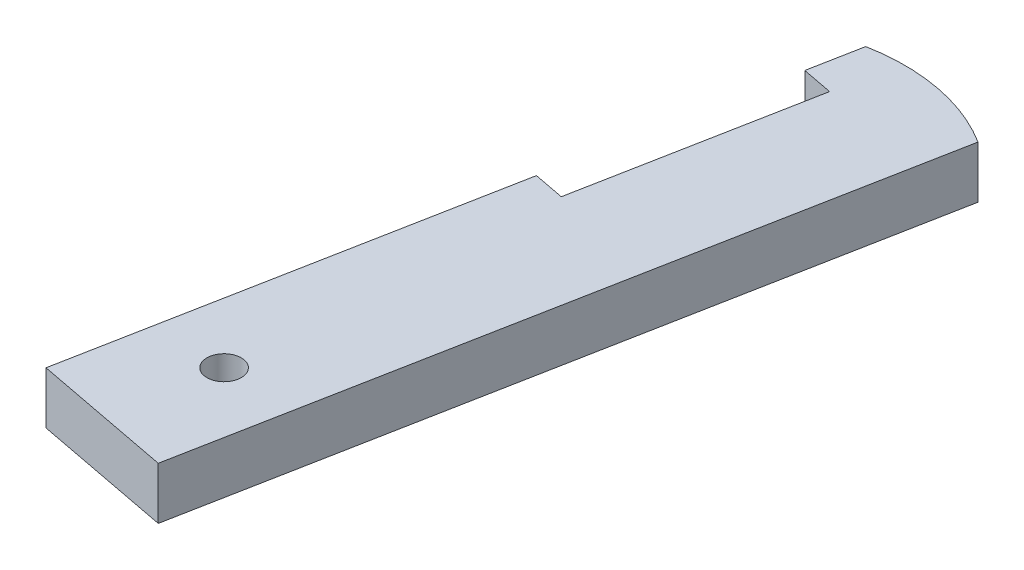
ISO-10303-21;
HEADER;
FILE_DESCRIPTION(('STEP AP214'),'2;1');
FILE_NAME('part.step','',(''),(''),'','','');
FILE_SCHEMA(('AUTOMOTIVE_DESIGN { 1 0 10303 214 1 1 1 1 }'));
ENDSEC;
DATA;
#1=APPLICATION_CONTEXT('core data for automotive mechanical design processes');
#2=APPLICATION_PROTOCOL_DEFINITION('international standard','automotive_design',2000,#1);
#3=PRODUCT_CONTEXT('',#1,'mechanical');
#4=PRODUCT('Part','Part','',(#3));
#5=PRODUCT_RELATED_PRODUCT_CATEGORY('part','',(#4));
#6=PRODUCT_DEFINITION_FORMATION('','',#4);
#7=PRODUCT_DEFINITION_CONTEXT('part definition',#1,'design');
#8=PRODUCT_DEFINITION('design','',#6,#7);
#9=PRODUCT_DEFINITION_SHAPE('','',#8);
#10=(LENGTH_UNIT() NAMED_UNIT(*) SI_UNIT(.MILLI.,.METRE.));
#11=(NAMED_UNIT(*) PLANE_ANGLE_UNIT() SI_UNIT($,.RADIAN.));
#12=(NAMED_UNIT(*) SI_UNIT($,.STERADIAN.) SOLID_ANGLE_UNIT());
#13=UNCERTAINTY_MEASURE_WITH_UNIT(LENGTH_MEASURE(1.E-05),#10,'distance_accuracy_value','');
#14=(GEOMETRIC_REPRESENTATION_CONTEXT(3) GLOBAL_UNCERTAINTY_ASSIGNED_CONTEXT((#13)) GLOBAL_UNIT_ASSIGNED_CONTEXT((#10,
#11,#12)) REPRESENTATION_CONTEXT('',''));
#15=CARTESIAN_POINT('',(0.,0.,0.));
#16=DIRECTION('',(0.,0.,1.));
#17=DIRECTION('',(1.,0.,0.));
#18=AXIS2_PLACEMENT_3D('',#15,#16,#17);
#19=CARTESIAN_POINT('',(0.,5.,0.));
#20=DIRECTION('',(0.,1.,0.));
#21=DIRECTION('',(0.,0.,1.));
#22=AXIS2_PLACEMENT_3D('',#19,#20,#21);
#23=PLANE('',#22);
#24=CARTESIAN_POINT('',(0.,5.,0.));
#25=DIRECTION('',(0.,1.,0.));
#26=DIRECTION('',(0.,0.,1.));
#27=AXIS2_PLACEMENT_3D('',#24,#25,#26);
#28=CIRCLE('',#27,18.5);
#29=CARTESIAN_POINT('',(9.89482128749763,5.,-15.6314590390176));
#30=VERTEX_POINT('',#29);
#31=CARTESIAN_POINT('',(-3.42343920553594,5.,-18.1804858022551));
#32=VERTEX_POINT('',#31);
#33=EDGE_CURVE('E145',#30,#32,#28,.T.);
#34=ORIENTED_EDGE('',*,*,#33,.T.);
#35=DIRECTION('',(-0.187981324722533,0.,0.982172602731089));
#36=VECTOR('',#35,1.);
#37=CARTESIAN_POINT('',(-3.42343920553594,5.,-18.1804858022551));
#38=LINE('',#37,#36);
#39=CARTESIAN_POINT('',(-4.3633458291486,5.,-13.2696227885997));
#40=VERTEX_POINT('',#39);
#41=EDGE_CURVE('E93',#32,#40,#38,.T.);
#42=ORIENTED_EDGE('',*,*,#41,.T.);
#43=DIRECTION('',(0.982172602731089,0.,0.187981324722532));
#44=VECTOR('',#43,1.);
#45=CARTESIAN_POINT('',(-1.41682802095534,5.,-12.7056788144321));
#46=LINE('',#45,#44);
#47=CARTESIAN_POINT('',(-1.41682802095534,5.,-12.7056788144321));
#48=VERTEX_POINT('',#47);
#49=EDGE_CURVE('E160',#40,#48,#46,.T.);
#50=ORIENTED_EDGE('',*,*,#49,.T.);
#51=DIRECTION('',(-0.187981324722533,0.,0.982172602731089));
#52=VECTOR('',#51,1.);
#53=CARTESIAN_POINT('',(-5.55241716485105,5.,8.90211844565189));
#54=LINE('',#53,#52);
#55=CARTESIAN_POINT('',(-5.55241716485105,5.,8.90211844565189));
#56=VERTEX_POINT('',#55);
#57=EDGE_CURVE('E173',#48,#56,#54,.T.);
#58=ORIENTED_EDGE('',*,*,#57,.T.);
#59=DIRECTION('',(-0.982172602731089,0.,-0.187981324722533));
#60=VECTOR('',#59,1.);
#61=CARTESIAN_POINT('',(-8.49893497304433,5.,8.33817447148429));
#62=LINE('',#61,#60);
#63=CARTESIAN_POINT('',(-8.49893497304433,5.,8.33817447148429));
#64=VERTEX_POINT('',#63);
#65=EDGE_CURVE('E112',#56,#64,#62,.T.);
#66=ORIENTED_EDGE('',*,*,#65,.T.);
#67=DIRECTION('',(-0.187981324722533,0.,0.982172602731089));
#68=VECTOR('',#67,1.);
#69=CARTESIAN_POINT('',(-8.49893497304433,5.,8.33817447148429));
#70=LINE('',#69,#68);
#71=CARTESIAN_POINT('',(-16.0581964826434,5.,47.8341167549357));
#72=VERTEX_POINT('',#71);
#73=EDGE_CURVE('E106',#64,#72,#70,.T.);
#74=ORIENTED_EDGE('',*,*,#73,.T.);
#75=DIRECTION('',(0.982172602731089,0.,0.187981324722533));
#76=VECTOR('',#75,1.);
#77=CARTESIAN_POINT('',(-16.0581964826434,5.,47.8341167549357));
#78=LINE('',#77,#76);
#79=CARTESIAN_POINT('',(-2.73993598960985,5.,50.3831435181732));
#80=VERTEX_POINT('',#79);
#81=EDGE_CURVE('E110',#72,#80,#78,.T.);
#82=ORIENTED_EDGE('',*,*,#81,.T.);
#83=DIRECTION('',(0.187981324722533,0.,-0.982172602731089));
#84=VECTOR('',#83,1.);
#85=CARTESIAN_POINT('',(9.89482128749763,5.,-15.6314590390176));
#86=LINE('',#85,#84);
#87=EDGE_CURVE('E50',#80,#30,#86,.T.);
#88=ORIENTED_EDGE('',*,*,#87,.T.);
#89=EDGE_LOOP('',(#34,#42,#50,#58,#66,#74,#82,#88));
#90=FACE_BOUND('',#89,.T.);
#91=CARTESIAN_POINT('',(-7.51925298890132,5.,39.2869041092436));
#92=DIRECTION('',(0.,1.,0.));
#93=DIRECTION('',(0.,0.,1.));
#94=AXIS2_PLACEMENT_3D('',#91,#92,#93);
#95=CIRCLE('',#94,1.65);
#96=CARTESIAN_POINT('',(-7.51925298890132,5.,40.9369041092436));
#97=VERTEX_POINT('',#96);
#98=EDGE_CURVE('E134',#97,#97,#95,.T.);
#99=ORIENTED_EDGE('',*,*,#98,.F.);
#100=EDGE_LOOP('',(#99));
#101=FACE_BOUND('',#100,.T.);
#102=ADVANCED_FACE('F33',(#90,#101),#23,.T.);
#103=CARTESIAN_POINT('',(0.,0.,0.));
#104=DIRECTION('',(0.,1.,0.));
#105=DIRECTION('',(0.,0.,1.));
#106=AXIS2_PLACEMENT_3D('',#103,#104,#105);
#107=PLANE('',#106);
#108=CARTESIAN_POINT('',(0.,0.,0.));
#109=DIRECTION('',(0.,1.,0.));
#110=DIRECTION('',(0.,0.,1.));
#111=AXIS2_PLACEMENT_3D('',#108,#109,#110);
#112=CIRCLE('',#111,18.5);
#113=CARTESIAN_POINT('',(9.89482128749763,0.,-15.6314590390176));
#114=VERTEX_POINT('',#113);
#115=CARTESIAN_POINT('',(-3.42343920553594,0.,-18.1804858022551));
#116=VERTEX_POINT('',#115);
#117=EDGE_CURVE('E130',#114,#116,#112,.T.);
#118=ORIENTED_EDGE('',*,*,#117,.F.);
#119=DIRECTION('',(0.187981324722533,0.,-0.982172602731089));
#120=VECTOR('',#119,1.);
#121=CARTESIAN_POINT('',(9.89482128749763,0.,-15.6314590390176));
#122=LINE('',#121,#120);
#123=CARTESIAN_POINT('',(-2.73993598960985,0.,50.3831435181732));
#124=VERTEX_POINT('',#123);
#125=EDGE_CURVE('E85',#124,#114,#122,.T.);
#126=ORIENTED_EDGE('',*,*,#125,.F.);
#127=DIRECTION('',(0.982172602731089,0.,0.187981324722533));
#128=VECTOR('',#127,1.);
#129=CARTESIAN_POINT('',(-16.0581964826434,0.,47.8341167549357));
#130=LINE('',#129,#128);
#131=CARTESIAN_POINT('',(-16.0581964826434,0.,47.8341167549357));
#132=VERTEX_POINT('',#131);
#133=EDGE_CURVE('E79',#132,#124,#130,.T.);
#134=ORIENTED_EDGE('',*,*,#133,.F.);
#135=DIRECTION('',(-0.187981324722533,0.,0.982172602731089));
#136=VECTOR('',#135,1.);
#137=CARTESIAN_POINT('',(-8.49893497304433,0.,8.33817447148429));
#138=LINE('',#137,#136);
#139=CARTESIAN_POINT('',(-8.49893497304433,0.,8.33817447148429));
#140=VERTEX_POINT('',#139);
#141=EDGE_CURVE('E120',#140,#132,#138,.T.);
#142=ORIENTED_EDGE('',*,*,#141,.F.);
#143=DIRECTION('',(-0.982172602731089,0.,-0.187981324722533));
#144=VECTOR('',#143,1.);
#145=CARTESIAN_POINT('',(-8.49893497304433,0.,8.33817447148429));
#146=LINE('',#145,#144);
#147=CARTESIAN_POINT('',(-5.55241716485105,0.,8.90211844565189));
#148=VERTEX_POINT('',#147);
#149=EDGE_CURVE('E140',#148,#140,#146,.T.);
#150=ORIENTED_EDGE('',*,*,#149,.F.);
#151=DIRECTION('',(-0.187981324722533,0.,0.982172602731089));
#152=VECTOR('',#151,1.);
#153=CARTESIAN_POINT('',(-5.55241716485105,0.,8.90211844565189));
#154=LINE('',#153,#152);
#155=CARTESIAN_POINT('',(-1.41682802095534,0.,-12.7056788144321));
#156=VERTEX_POINT('',#155);
#157=EDGE_CURVE('E138',#156,#148,#154,.T.);
#158=ORIENTED_EDGE('',*,*,#157,.F.);
#159=DIRECTION('',(0.982172602731089,0.,0.187981324722532));
#160=VECTOR('',#159,1.);
#161=CARTESIAN_POINT('',(-1.41682802095534,0.,-12.7056788144321));
#162=LINE('',#161,#160);
#163=CARTESIAN_POINT('',(-4.3633458291486,0.,-13.2696227885997));
#164=VERTEX_POINT('',#163);
#165=EDGE_CURVE('E136',#164,#156,#162,.T.);
#166=ORIENTED_EDGE('',*,*,#165,.F.);
#167=DIRECTION('',(-0.187981324722533,0.,0.982172602731089));
#168=VECTOR('',#167,1.);
#169=CARTESIAN_POINT('',(-3.42343920553594,0.,-18.1804858022551));
#170=LINE('',#169,#168);
#171=EDGE_CURVE('E133',#116,#164,#170,.T.);
#172=ORIENTED_EDGE('',*,*,#171,.F.);
#173=EDGE_LOOP('',(#118,#126,#134,#142,#150,#158,#166,#172));
#174=FACE_BOUND('',#173,.T.);
#175=CARTESIAN_POINT('',(-7.51925298890132,0.,39.2869041092436));
#176=DIRECTION('',(0.,1.,0.));
#177=DIRECTION('',(0.,0.,1.));
#178=AXIS2_PLACEMENT_3D('',#175,#176,#177);
#179=CIRCLE('',#178,1.65);
#180=CARTESIAN_POINT('',(-7.51925298890132,0.,40.9369041092436));
#181=VERTEX_POINT('',#180);
#182=EDGE_CURVE('E179',#181,#181,#179,.T.);
#183=ORIENTED_EDGE('',*,*,#182,.T.);
#184=EDGE_LOOP('',(#183));
#185=FACE_BOUND('',#184,.T.);
#186=ADVANCED_FACE('F164',(#174,#185),#107,.F.);
#187=CARTESIAN_POINT('',(0.,5.,0.));
#188=DIRECTION('',(0.,-1.,0.));
#189=DIRECTION('',(0.,0.,-1.));
#190=AXIS2_PLACEMENT_3D('',#187,#188,#189);
#191=CYLINDRICAL_SURFACE('',#190,18.5);
#192=ORIENTED_EDGE('',*,*,#117,.T.);
#193=DIRECTION('',(0.,-1.,0.));
#194=VECTOR('',#193,1.);
#195=CARTESIAN_POINT('',(-3.42343920553594,5.,-18.1804858022551));
#196=LINE('',#195,#194);
#197=EDGE_CURVE('E11',#32,#116,#196,.T.);
#198=ORIENTED_EDGE('',*,*,#197,.F.);
#199=ORIENTED_EDGE('',*,*,#33,.F.);
#200=DIRECTION('',(0.,-1.,0.));
#201=VECTOR('',#200,1.);
#202=CARTESIAN_POINT('',(9.89482128749763,5.,-15.6314590390176));
#203=LINE('',#202,#201);
#204=EDGE_CURVE('E126',#30,#114,#203,.T.);
#205=ORIENTED_EDGE('',*,*,#204,.T.);
#206=EDGE_LOOP('',(#192,#198,#199,#205));
#207=FACE_BOUND('',#206,.T.);
#208=ADVANCED_FACE('F35',(#207),#191,.T.);
#209=CARTESIAN_POINT('',(-3.42343920553594,5.,-18.1804858022551));
#210=DIRECTION('',(0.982172602731089,0.,0.187981324722533));
#211=DIRECTION('',(0.187981324722533,0.,-0.982172602731089));
#212=AXIS2_PLACEMENT_3D('',#209,#210,#211);
#213=PLANE('',#212);
#214=ORIENTED_EDGE('',*,*,#171,.T.);
#215=DIRECTION('',(0.,-1.,0.));
#216=VECTOR('',#215,1.);
#217=CARTESIAN_POINT('',(-4.3633458291486,5.,-13.2696227885997));
#218=LINE('',#217,#216);
#219=EDGE_CURVE('E42',#40,#164,#218,.T.);
#220=ORIENTED_EDGE('',*,*,#219,.F.);
#221=ORIENTED_EDGE('',*,*,#41,.F.);
#222=ORIENTED_EDGE('',*,*,#197,.T.);
#223=EDGE_LOOP('',(#214,#220,#221,#222));
#224=FACE_BOUND('',#223,.T.);
#225=ADVANCED_FACE('F207',(#224),#213,.F.);
#226=CARTESIAN_POINT('',(-1.41682802095534,5.,-12.7056788144321));
#227=DIRECTION('',(0.187981324722532,0.,-0.982172602731089));
#228=DIRECTION('',(-0.982172602731089,0.,-0.187981324722532));
#229=AXIS2_PLACEMENT_3D('',#226,#227,#228);
#230=PLANE('',#229);
#231=ORIENTED_EDGE('',*,*,#165,.T.);
#232=DIRECTION('',(0.,-1.,0.));
#233=VECTOR('',#232,1.);
#234=CARTESIAN_POINT('',(-1.41682802095534,5.,-12.7056788144321));
#235=LINE('',#234,#233);
#236=EDGE_CURVE('E152',#48,#156,#235,.T.);
#237=ORIENTED_EDGE('',*,*,#236,.F.);
#238=ORIENTED_EDGE('',*,*,#49,.F.);
#239=ORIENTED_EDGE('',*,*,#219,.T.);
#240=EDGE_LOOP('',(#231,#237,#238,#239));
#241=FACE_BOUND('',#240,.T.);
#242=ADVANCED_FACE('F158',(#241),#230,.F.);
#243=CARTESIAN_POINT('',(-5.55241716485105,5.,8.90211844565189));
#244=DIRECTION('',(0.982172602731089,0.,0.187981324722533));
#245=DIRECTION('',(0.187981324722533,0.,-0.982172602731089));
#246=AXIS2_PLACEMENT_3D('',#243,#244,#245);
#247=PLANE('',#246);
#248=ORIENTED_EDGE('',*,*,#157,.T.);
#249=DIRECTION('',(0.,-1.,0.));
#250=VECTOR('',#249,1.);
#251=CARTESIAN_POINT('',(-5.55241716485105,5.,8.90211844565189));
#252=LINE('',#251,#250);
#253=EDGE_CURVE('E149',#56,#148,#252,.T.);
#254=ORIENTED_EDGE('',*,*,#253,.F.);
#255=ORIENTED_EDGE('',*,*,#57,.F.);
#256=ORIENTED_EDGE('',*,*,#236,.T.);
#257=EDGE_LOOP('',(#248,#254,#255,#256));
#258=FACE_BOUND('',#257,.T.);
#259=ADVANCED_FACE('F169',(#258),#247,.F.);
#260=CARTESIAN_POINT('',(-8.49893497304433,5.,8.33817447148429));
#261=DIRECTION('',(-0.187981324722533,0.,0.982172602731089));
#262=DIRECTION('',(0.982172602731089,0.,0.187981324722533));
#263=AXIS2_PLACEMENT_3D('',#260,#261,#262);
#264=PLANE('',#263);
#265=ORIENTED_EDGE('',*,*,#149,.T.);
#266=DIRECTION('',(0.,-1.,0.));
#267=VECTOR('',#266,1.);
#268=CARTESIAN_POINT('',(-8.49893497304433,5.,8.33817447148429));
#269=LINE('',#268,#267);
#270=EDGE_CURVE('E121',#64,#140,#269,.T.);
#271=ORIENTED_EDGE('',*,*,#270,.F.);
#272=ORIENTED_EDGE('',*,*,#65,.F.);
#273=ORIENTED_EDGE('',*,*,#253,.T.);
#274=EDGE_LOOP('',(#265,#271,#272,#273));
#275=FACE_BOUND('',#274,.T.);
#276=ADVANCED_FACE('F172',(#275),#264,.F.);
#277=CARTESIAN_POINT('',(-8.49893497304433,5.,8.33817447148429));
#278=DIRECTION('',(0.982172602731089,0.,0.187981324722533));
#279=DIRECTION('',(0.187981324722533,0.,-0.982172602731089));
#280=AXIS2_PLACEMENT_3D('',#277,#278,#279);
#281=PLANE('',#280);
#282=ORIENTED_EDGE('',*,*,#141,.T.);
#283=DIRECTION('',(0.,-1.,0.));
#284=VECTOR('',#283,1.);
#285=CARTESIAN_POINT('',(-16.0581964826434,5.,47.8341167549357));
#286=LINE('',#285,#284);
#287=EDGE_CURVE('E117',#72,#132,#286,.T.);
#288=ORIENTED_EDGE('',*,*,#287,.F.);
#289=ORIENTED_EDGE('',*,*,#73,.F.);
#290=ORIENTED_EDGE('',*,*,#270,.T.);
#291=EDGE_LOOP('',(#282,#288,#289,#290));
#292=FACE_BOUND('',#291,.T.);
#293=ADVANCED_FACE('F118',(#292),#281,.F.);
#294=CARTESIAN_POINT('',(-16.0581964826434,5.,47.8341167549357));
#295=DIRECTION('',(0.187981324722533,0.,-0.982172602731089));
#296=DIRECTION('',(-0.982172602731089,0.,-0.187981324722533));
#297=AXIS2_PLACEMENT_3D('',#294,#295,#296);
#298=PLANE('',#297);
#299=ORIENTED_EDGE('',*,*,#133,.T.);
#300=DIRECTION('',(0.,-1.,0.));
#301=VECTOR('',#300,1.);
#302=CARTESIAN_POINT('',(-2.73993598960985,5.,50.3831435181732));
#303=LINE('',#302,#301);
#304=EDGE_CURVE('E122',#80,#124,#303,.T.);
#305=ORIENTED_EDGE('',*,*,#304,.F.);
#306=ORIENTED_EDGE('',*,*,#81,.F.);
#307=ORIENTED_EDGE('',*,*,#287,.T.);
#308=EDGE_LOOP('',(#299,#305,#306,#307));
#309=FACE_BOUND('',#308,.T.);
#310=ADVANCED_FACE('F124',(#309),#298,.F.);
#311=CARTESIAN_POINT('',(9.89482128749763,5.,-15.6314590390176));
#312=DIRECTION('',(-0.982172602731089,0.,-0.187981324722533));
#313=DIRECTION('',(-0.187981324722533,0.,0.982172602731089));
#314=AXIS2_PLACEMENT_3D('',#311,#312,#313);
#315=PLANE('',#314);
#316=ORIENTED_EDGE('',*,*,#125,.T.);
#317=ORIENTED_EDGE('',*,*,#204,.F.);
#318=ORIENTED_EDGE('',*,*,#87,.F.);
#319=ORIENTED_EDGE('',*,*,#304,.T.);
#320=EDGE_LOOP('',(#316,#317,#318,#319));
#321=FACE_BOUND('',#320,.T.);
#322=ADVANCED_FACE('F195',(#321),#315,.F.);
#323=CARTESIAN_POINT('',(-7.51925298890132,5.,39.2869041092436));
#324=DIRECTION('',(0.,-1.,0.));
#325=DIRECTION('',(0.,0.,-1.));
#326=AXIS2_PLACEMENT_3D('',#323,#324,#325);
#327=CYLINDRICAL_SURFACE('',#326,1.65);
#328=ORIENTED_EDGE('',*,*,#98,.T.);
#329=EDGE_LOOP('',(#328));
#330=FACE_BOUND('',#329,.T.);
#331=ORIENTED_EDGE('',*,*,#182,.F.);
#332=EDGE_LOOP('',(#331));
#333=FACE_BOUND('',#332,.T.);
#334=ADVANCED_FACE('F185',(#330,#333),#327,.F.);
#335=CLOSED_SHELL('',(#102,#186,#208,#225,#242,#259,#276,#293,#310,#322,#334));
#336=MANIFOLD_SOLID_BREP('B2',#335);
#337=ADVANCED_BREP_SHAPE_REPRESENTATION('',(#18,#336),#14);
#338=SHAPE_DEFINITION_REPRESENTATION(#9,#337);
ENDSEC;
END-ISO-10303-21;
